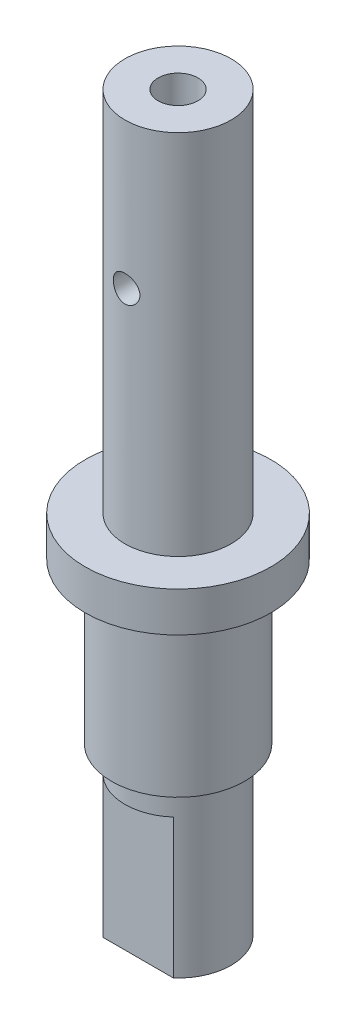
ISO-10303-21;
HEADER;
FILE_DESCRIPTION(('STEP AP214'),'2;1');
FILE_NAME('part.step','',(''),(''),'','','');
FILE_SCHEMA(('AUTOMOTIVE_DESIGN { 1 0 10303 214 1 1 1 1 }'));
ENDSEC;
DATA;
#1=APPLICATION_CONTEXT('core data for automotive mechanical design processes');
#2=APPLICATION_PROTOCOL_DEFINITION('international standard','automotive_design',2000,#1);
#3=PRODUCT_CONTEXT('',#1,'mechanical');
#4=PRODUCT('Part','Part','',(#3));
#5=PRODUCT_RELATED_PRODUCT_CATEGORY('part','',(#4));
#6=PRODUCT_DEFINITION_FORMATION('','',#4);
#7=PRODUCT_DEFINITION_CONTEXT('part definition',#1,'design');
#8=PRODUCT_DEFINITION('design','',#6,#7);
#9=PRODUCT_DEFINITION_SHAPE('','',#8);
#10=(LENGTH_UNIT() NAMED_UNIT(*) SI_UNIT(.MILLI.,.METRE.));
#11=(NAMED_UNIT(*) PLANE_ANGLE_UNIT() SI_UNIT($,.RADIAN.));
#12=(NAMED_UNIT(*) SI_UNIT($,.STERADIAN.) SOLID_ANGLE_UNIT());
#13=UNCERTAINTY_MEASURE_WITH_UNIT(LENGTH_MEASURE(1.E-05),#10,'distance_accuracy_value','');
#14=(GEOMETRIC_REPRESENTATION_CONTEXT(3) GLOBAL_UNCERTAINTY_ASSIGNED_CONTEXT((#13)) GLOBAL_UNIT_ASSIGNED_CONTEXT((#10,
#11,#12)) REPRESENTATION_CONTEXT('',''));
#15=CARTESIAN_POINT('',(0.,0.,0.));
#16=DIRECTION('',(0.,0.,1.));
#17=DIRECTION('',(1.,0.,0.));
#18=AXIS2_PLACEMENT_3D('',#15,#16,#17);
#19=CARTESIAN_POINT('',(0.,39.8,0.));
#20=DIRECTION('',(0.,-1.,0.));
#21=DIRECTION('',(0.,0.,-1.));
#22=AXIS2_PLACEMENT_3D('',#19,#20,#21);
#23=CYLINDRICAL_SURFACE('',#22,4.);
#24=CARTESIAN_POINT('',(0.,27.5,0.));
#25=DIRECTION('',(0.,1.,0.));
#26=DIRECTION('',(0.,0.,1.));
#27=AXIS2_PLACEMENT_3D('',#24,#25,#26);
#28=CIRCLE('',#27,4.);
#29=CARTESIAN_POINT('',(0.,27.5,4.));
#30=VERTEX_POINT('',#29);
#31=EDGE_CURVE('E74',#30,#30,#28,.T.);
#32=ORIENTED_EDGE('',*,*,#31,.T.);
#33=EDGE_LOOP('',(#32));
#34=FACE_BOUND('',#33,.T.);
#35=CARTESIAN_POINT('',(0.,55.15455,0.));
#36=DIRECTION('',(0.,1.,0.));
#37=DIRECTION('',(0.,0.,1.));
#38=AXIS2_PLACEMENT_3D('',#35,#36,#37);
#39=CIRCLE('',#38,4.);
#40=CARTESIAN_POINT('',(0.,55.15455,4.));
#41=VERTEX_POINT('',#40);
#42=EDGE_CURVE('E70',#41,#41,#39,.T.);
#43=ORIENTED_EDGE('',*,*,#42,.F.);
#44=EDGE_LOOP('',(#43));
#45=FACE_BOUND('',#44,.T.);
#46=CARTESIAN_POINT('',(-1.,44.15455,3.87298334620742));
#47=CARTESIAN_POINT('',(-0.999998431438699,44.0993296996432,3.87298440057185));
#48=CARTESIAN_POINT('',(-0.995410498208069,44.0440920405686,3.87417722499278));
#49=CARTESIAN_POINT('',(-0.977209250194446,43.9352029687674,3.87880744892249));
#50=CARTESIAN_POINT('',(-0.963590682698078,43.88155249822,3.8822461547418));
#51=CARTESIAN_POINT('',(-0.927796479849636,43.7774285847122,3.89095489813012));
#52=CARTESIAN_POINT('',(-0.905631891140945,43.7269511378422,3.8962225706936));
#53=CARTESIAN_POINT('',(-0.853408456505408,43.6304256589875,3.90799276818327));
#54=CARTESIAN_POINT('',(-0.823349275424506,43.5843778151688,3.91449534553241));
#55=CARTESIAN_POINT('',(-0.755483370924517,43.4970053418942,3.92816286540368));
#56=CARTESIAN_POINT('',(-0.717534755081556,43.4557925598597,3.93533839048709));
#57=CARTESIAN_POINT('',(-0.635272825640327,43.3802454422561,3.94945150206622));
#58=CARTESIAN_POINT('',(-0.590958917672139,43.3459117497514,3.95638906626691));
#59=CARTESIAN_POINT('',(-0.496458080431565,43.2846398129474,3.96936166208095));
#60=CARTESIAN_POINT('',(-0.446197830478044,43.2578114447354,3.975382749602));
#61=CARTESIAN_POINT('',(-0.341705273717111,43.2130261423388,3.9857232477043));
#62=CARTESIAN_POINT('',(-0.287473554316779,43.1950678992338,3.99004290933747));
#63=CARTESIAN_POINT('',(-0.177743503501666,43.1688908661686,3.99641903539262));
#64=CARTESIAN_POINT('',(-0.122293087819592,43.1604821422694,3.99851957537723));
#65=CARTESIAN_POINT('',(-0.0107315277051104,43.1530466482898,4.00037437642922));
#66=CARTESIAN_POINT('',(0.0453795178152254,43.1540184911162,4.00012898438682));
#67=CARTESIAN_POINT('',(0.155352247172385,43.1651799401001,3.99735237981413));
#68=CARTESIAN_POINT('',(0.209236215601064,43.1751645300215,3.99487200936349));
#69=CARTESIAN_POINT('',(0.314538247413684,43.2037385080194,3.98796334609942));
#70=CARTESIAN_POINT('',(0.365956179370436,43.222328354151,3.98353494959376));
#71=CARTESIAN_POINT('',(0.465406703501805,43.2677510282748,3.97315003880358));
#72=CARTESIAN_POINT('',(0.513404509766502,43.2946568178647,3.96718007878021));
#73=CARTESIAN_POINT('',(0.604275622340487,43.3558922716465,3.9543596152386));
#74=CARTESIAN_POINT('',(0.647148035085504,43.3902232274242,3.94750895860996));
#75=CARTESIAN_POINT('',(0.727774035084956,43.4664334967929,3.93345485507808));
#76=CARTESIAN_POINT('',(0.7653576790752,43.5084919569391,3.92624687810367));
#77=CARTESIAN_POINT('',(0.832976375963018,43.5983899894161,3.91246017406683));
#78=CARTESIAN_POINT('',(0.863011076046015,43.6462298317964,3.90588147642388));
#79=CARTESIAN_POINT('',(0.914788129022599,43.7466660136596,3.89408198732659));
#80=CARTESIAN_POINT('',(0.936489566970495,43.7992842921253,3.88886793490288));
#81=CARTESIAN_POINT('',(0.970685620636345,43.9075841872306,3.88047456055983));
#82=CARTESIAN_POINT('',(0.983182206552913,43.9632651455933,3.87729480324087));
#83=CARTESIAN_POINT('',(0.998331855466072,44.0745338006093,3.87342142415656));
#84=CARTESIAN_POINT('',(1.00123618956785,44.1300851173319,3.87266435637459));
#85=CARTESIAN_POINT('',(0.997806796206221,44.2408787746313,3.87354937392416));
#86=CARTESIAN_POINT('',(0.991473919139522,44.2961211431805,3.87519123840506));
#87=CARTESIAN_POINT('',(0.969970185575068,44.4037957059819,3.88062832781824));
#88=CARTESIAN_POINT('',(0.954945627312702,44.4562590906283,3.8843878809375));
#89=CARTESIAN_POINT('',(0.916647232668252,44.5579225831407,3.89360287308385));
#90=CARTESIAN_POINT('',(0.893372419085022,44.6071223036221,3.89905851299445));
#91=CARTESIAN_POINT('',(0.838708267174626,44.7019265111469,3.91118454837305));
#92=CARTESIAN_POINT('',(0.807168701534255,44.7474415360172,3.91787667442657));
#93=CARTESIAN_POINT('',(0.737060292934458,44.8326253451205,3.93166833228686));
#94=CARTESIAN_POINT('',(0.69849029480544,44.87229316666,3.93876793091388));
#95=CARTESIAN_POINT('',(0.614262720984726,44.9456744170284,3.95278961212642));
#96=CARTESIAN_POINT('',(0.568451952531594,44.9792140250195,3.95970280824734));
#97=CARTESIAN_POINT('',(0.47170268269468,45.0381243467805,3.97238886645493));
#98=CARTESIAN_POINT('',(0.420764448957598,45.0634954866433,3.97816178801584));
#99=CARTESIAN_POINT('',(0.315558201731099,45.1051284138112,3.98788046295326));
#100=CARTESIAN_POINT('',(0.261317381027889,45.1214557137516,3.99183932008964));
#101=CARTESIAN_POINT('',(0.150749760318814,45.1447341338434,3.99754117358315));
#102=CARTESIAN_POINT('',(0.0944233650412485,45.1516870634956,3.99928459757363));
#103=CARTESIAN_POINT('',(-0.0170835264433228,45.1559175895755,4.00034169408811));
#104=CARTESIAN_POINT('',(-0.0722538269660297,45.1534517090954,3.99971978880008));
#105=CARTESIAN_POINT('',(-0.181367496414736,45.1395021727057,3.99625896457423));
#106=CARTESIAN_POINT('',(-0.235310901780882,45.1280187849869,3.99342011157094));
#107=CARTESIAN_POINT('',(-0.340171035644812,45.0964977802291,3.98585432853963));
#108=CARTESIAN_POINT('',(-0.391102494581016,45.0765065466854,3.98113764502669));
#109=CARTESIAN_POINT('',(-0.488917053041465,45.0285794209807,3.97031288913382));
#110=CARTESIAN_POINT('',(-0.535799641265047,45.0006425273304,3.96420464137727));
#111=CARTESIAN_POINT('',(-0.625401928423895,44.9368347660029,3.95107249681342));
#112=CARTESIAN_POINT('',(-0.66799498830058,44.9007898570926,3.94403016945647));
#113=CARTESIAN_POINT('',(-0.746615020271247,44.8221271480262,3.92990649053207));
#114=CARTESIAN_POINT('',(-0.782640325068175,44.7795076839021,3.92282512952424));
#115=CARTESIAN_POINT('',(-0.847762026479239,44.6879485857987,3.90927475860683));
#116=CARTESIAN_POINT('',(-0.876716619446591,44.6389058765875,3.90281963730391));
#117=CARTESIAN_POINT('',(-0.92592689661562,44.5364945100772,3.8914395555011));
#118=CARTESIAN_POINT('',(-0.946188909759556,44.4831290338927,3.88651348244814));
#119=CARTESIAN_POINT('',(-0.974422528565571,44.3839729881737,3.87951908741315));
#120=CARTESIAN_POINT('',(-0.983993170595827,44.3386568356176,3.87708663005761));
#121=CARTESIAN_POINT('',(-0.996782292572818,44.2470811309985,3.87381838580358));
#122=CARTESIAN_POINT('',(-1.00000131437052,44.2008216597494,3.87298246270639));
#123=CARTESIAN_POINT('',(-1.,44.15455,3.87298334620742));
#124=B_SPLINE_CURVE_WITH_KNOTS('',3,(#46,#47,#48,#49,#50,#51,#52,#53,#54,#55,#56,#57,#58,#59,
#60,#61,#62,#63,#64,#65,#66,#67,#68,#69,#70,#71,#72,#73,#74,#75,#76,#77,#78,#79,#80,#81,#82,#83,
#84,#85,#86,#87,#88,#89,#90,#91,#92,#93,#94,#95,#96,#97,#98,#99,#100,#101,#102,#103,#104,#105,
#106,#107,#108,#109,#110,#111,#112,#113,#114,#115,#116,#117,#118,#119,#120,#121,#122,#123),
.UNSPECIFIED.,.T.,.F.,(4,2,2,2,2,2,2,2,2,2,2,2,2,2,2,2,2,2,2,2,2,2,2,2,2,2,2,2,2,2,2,2,2,2,2,2,
2,2,4),(0.,0.165490976675223,0.331078296534208,0.496452290829152,0.66183330698466,
0.830495816734648,0.999174085882211,1.17020598555442,1.34121263935111,1.50875500394413,
1.67627259462682,1.84007305071853,2.00388222686189,2.16917149698052,2.33448954183839,
2.50428186625039,2.67408212476195,2.84470572799636,3.01529280048094,3.18137429900961,
3.34744050869795,3.51078961999957,3.67415808564842,3.84073138339938,4.00733207550293,
4.17810132382402,4.34886166284095,4.51836829119046,4.6878421955989,4.85273378447257,
5.01762046947067,5.18161950620159,5.34563922291503,5.51358838629102,5.68158012622479,
5.85270590910146,6.02370688542922,6.16239130867207,6.30106390036083),.UNSPECIFIED.);
#125=CARTESIAN_POINT('',(-1.,44.15455,3.87298334620742));
#126=VERTEX_POINT('',#125);
#127=EDGE_CURVE('E83',#126,#126,#124,.T.);
#128=ORIENTED_EDGE('',*,*,#127,.F.);
#129=EDGE_LOOP('',(#128));
#130=FACE_BOUND('',#129,.T.);
#131=CARTESIAN_POINT('',(0.,45.15455,-4.));
#132=CARTESIAN_POINT('',(0.055250725779821,45.1545484495079,-3.99999906578675));
#133=CARTESIAN_POINT('',(0.110518771887176,45.1499556328175,-3.99884385421219));
#134=CARTESIAN_POINT('',(0.219470882513689,45.131733232462,-3.99434742553261));
#135=CARTESIAN_POINT('',(0.27315403124716,45.1180985269748,-3.99100496946646));
#136=CARTESIAN_POINT('',(0.377347248121718,45.0822571643586,-3.98250417554693));
#137=CARTESIAN_POINT('',(0.427861042286668,45.0600608008565,-3.97734801894725));
#138=CARTESIAN_POINT('',(0.524448087936285,45.0077624066368,-3.96576895871729));
#139=CARTESIAN_POINT('',(0.570521189565841,44.977660109254,-3.95934601236034));
#140=CARTESIAN_POINT('',(0.65786795153395,44.9097494735639,-3.94578275727867));
#141=CARTESIAN_POINT('',(0.699037126707384,44.8718089500272,-3.93863138099022));
#142=CARTESIAN_POINT('',(0.774499284802206,44.7895818633941,-3.92449080078353));
#143=CARTESIAN_POINT('',(0.808791491299427,44.7452945847023,-3.91750161525565));
#144=CARTESIAN_POINT('',(0.870017695199359,44.6508198488417,-3.9043651713314));
#145=CARTESIAN_POINT('',(0.896834810616908,44.6005545127931,-3.89823196313737));
#146=CARTESIAN_POINT('',(0.941597939033687,44.4960510588944,-3.88766329874815));
#147=CARTESIAN_POINT('',(0.959545370292891,44.4418135777828,-3.88322757115192));
#148=CARTESIAN_POINT('',(0.985703224536196,44.3320543345317,-3.87666984478367));
#149=CARTESIAN_POINT('',(0.994101512222228,44.2765800693001,-3.87450327383617));
#150=CARTESIAN_POINT('',(1.00150785004524,44.1649709539907,-3.87259575025161));
#151=CARTESIAN_POINT('',(1.00051742787865,44.1088362128676,-3.87285440299096));
#152=CARTESIAN_POINT('',(0.989324349759521,43.9989394615037,-3.87572803664412));
#153=CARTESIAN_POINT('',(0.979345560127014,43.9451529190233,-3.87828575334586));
#154=CARTESIAN_POINT('',(0.950816124602072,43.8400426327258,-3.88537806450989));
#155=CARTESIAN_POINT('',(0.932264868046284,43.7887190646473,-3.88991279980464));
#156=CARTESIAN_POINT('',(0.886926318624771,43.6893913224986,-3.90050075936124));
#157=CARTESIAN_POINT('',(0.860057778155275,43.6414258854736,-3.90656884979614));
#158=CARTESIAN_POINT('',(0.798904184009969,43.5506041934954,-3.91953140564257));
#159=CARTESIAN_POINT('',(0.764617832539226,43.5077488346218,-3.9264260155649));
#160=CARTESIAN_POINT('',(0.68844228312081,43.4270809228704,-3.94050587026521));
#161=CARTESIAN_POINT('',(0.64636417211057,43.3894470066258,-3.94769379651981));
#162=CARTESIAN_POINT('',(0.556407945002463,43.3217358383574,-3.96137310385857));
#163=CARTESIAN_POINT('',(0.508529651805292,43.2916588171576,-3.96786446366277));
#164=CARTESIAN_POINT('',(0.408077259120924,43.2398496091837,-3.97945154729455));
#165=CARTESIAN_POINT('',(0.355487595472413,43.2181464398304,-3.9845424008515));
#166=CARTESIAN_POINT('',(0.247250672095254,43.1839384628603,-3.99271944660946));
#167=CARTESIAN_POINT('',(0.191603999433655,43.1714318957212,-3.99580602226187));
#168=CARTESIAN_POINT('',(0.0803599802600168,43.1562449562941,-3.9995699951425));
#169=CARTESIAN_POINT('',(0.0247978133254723,43.1533213159498,-4.00030702338852));
#170=CARTESIAN_POINT('',(-0.086021916534339,43.1567160013703,-3.999458698763));
#171=CARTESIAN_POINT('',(-0.14127950642973,43.1630334951994,-3.99787355494564));
#172=CARTESIAN_POINT('',(-0.249076179184328,43.1845306055943,-3.99259720751571));
#173=CARTESIAN_POINT('',(-0.301643412645836,43.1995775089847,-3.98893756123874));
#174=CARTESIAN_POINT('',(-0.403504861635007,43.2379547226856,-3.97992471089423));
#175=CARTESIAN_POINT('',(-0.452798746021756,43.2612858695421,-3.97457133579928));
#176=CARTESIAN_POINT('',(-0.547682089619897,43.3160407525831,-3.96262205284207));
#177=CARTESIAN_POINT('',(-0.593190294557219,43.3476007415978,-3.95600578244621));
#178=CARTESIAN_POINT('',(-0.678351075762164,43.4177432725313,-3.94229672791613));
#179=CARTESIAN_POINT('',(-0.718002639315339,43.4563270264113,-3.93520386167803));
#180=CARTESIAN_POINT('',(-0.79132704538182,43.5405513072296,-3.92112637973847));
#181=CARTESIAN_POINT('',(-0.824829245081354,43.5863418020016,-3.91414869458187));
#182=CARTESIAN_POINT('',(-0.883673839341797,43.6830384229771,-3.90128585584826));
#183=CARTESIAN_POINT('',(-0.909016596105291,43.7339443219732,-3.89540065378017));
#184=CARTESIAN_POINT('',(-0.950634280406195,43.8391538149421,-3.88545396489777));
#185=CARTESIAN_POINT('',(-0.96696293110271,43.8934350855627,-3.88138170194604));
#186=CARTESIAN_POINT('',(-0.990230439969184,44.0040897585927,-3.87551162726789));
#187=CARTESIAN_POINT('',(-0.997171351652437,44.0604627006883,-3.87371331813291));
#188=CARTESIAN_POINT('',(-1.00135906022266,44.1719640159035,-3.87263267469305));
#189=CARTESIAN_POINT('',(-0.99887859852008,44.2270816234165,-3.87327955152176));
#190=CARTESIAN_POINT('',(-0.984918185541913,44.3360859257786,-3.87685272671895));
#191=CARTESIAN_POINT('',(-0.973438415124514,44.3899726453424,-3.87977897927904));
#192=CARTESIAN_POINT('',(-0.941954212961864,44.4946889727103,-3.88754173788482));
#193=CARTESIAN_POINT('',(-0.922000936453586,44.5455348701601,-3.89236676824206));
#194=CARTESIAN_POINT('',(-0.87417660907005,44.6431935884758,-3.90338503816552));
#195=CARTESIAN_POINT('',(-0.846304460022793,44.6900058487913,-3.90957846747182));
#196=CARTESIAN_POINT('',(-0.782578499091425,44.7795864193347,-3.92283756175675));
#197=CARTESIAN_POINT('',(-0.746535441941506,44.8222173822826,-3.92992176554505));
#198=CARTESIAN_POINT('',(-0.66785958079316,44.9009146965303,-3.94405351497524));
#199=CARTESIAN_POINT('',(-0.625225214174098,44.936979486742,-3.95110105151373));
#200=CARTESIAN_POINT('',(-0.533645057801725,45.0021575390431,-3.96451770431775));
#201=CARTESIAN_POINT('',(-0.484598948210923,45.0311330757811,-3.97087222243912));
#202=CARTESIAN_POINT('',(-0.382177373006983,45.0803816419604,-3.98203283316746));
#203=CARTESIAN_POINT('',(-0.328805042291159,45.100660907099,-3.98684003466521));
#204=CARTESIAN_POINT('',(-0.229606835495647,45.1289312202198,-3.99365373043694));
#205=CARTESIAN_POINT('',(-0.184253447272045,45.138517495369,-3.9960172336846));
#206=CARTESIAN_POINT('',(-0.0926040476908553,45.151327295748,-3.99919070154632));
#207=CARTESIAN_POINT('',(-0.0463081074950775,45.1545512995369,-4.00000078300596));
#208=CARTESIAN_POINT('',(0.,45.15455,-4.));
#209=B_SPLINE_CURVE_WITH_KNOTS('',3,(#131,#132,#133,#134,#135,#136,#137,#138,#139,#140,#141,
#142,#143,#144,#145,#146,#147,#148,#149,#150,#151,#152,#153,#154,#155,#156,#157,#158,#159,#160,
#161,#162,#163,#164,#165,#166,#167,#168,#169,#170,#171,#172,#173,#174,#175,#176,#177,#178,#179,
#180,#181,#182,#183,#184,#185,#186,#187,#188,#189,#190,#191,#192,#193,#194,#195,#196,#197,#198,
#199,#200,#201,#202,#203,#204,#205,#206,#207,#208),.UNSPECIFIED.,.T.,.F.,(4,2,2,2,2,2,2,2,2,2,2,
2,2,2,2,2,2,2,2,2,2,2,2,2,2,2,2,2,2,2,2,2,2,2,2,2,2,2,4),(0.,0.165582474981261,
0.331258825175934,0.496736601524069,0.662219960112887,0.830762902914267,0.999324863867081,
1.17039098363872,1.34142974112912,1.50904196732954,1.67662692075132,1.84014998004679,
2.00368468977359,2.16887018582587,2.33408460557443,2.50401000646014,2.67394059705499,
2.84445486006077,3.01493649125763,3.18105539299518,3.34715934075162,3.51080183009359,
3.67446084881527,3.84102391710235,4.0076157533868,4.17829672802985,4.34897012499672,
4.51861503076025,4.68822282168272,4.85295853599075,5.0176909397069,5.18144267039631,
5.34521712091268,5.51326384273273,5.68135046513612,5.85248123666393,6.02348909214234,
6.16228161961433,6.3010637069536),.UNSPECIFIED.);
#210=CARTESIAN_POINT('',(0.,45.15455,-4.));
#211=VERTEX_POINT('',#210);
#212=EDGE_CURVE('E36',#211,#211,#209,.T.);
#213=ORIENTED_EDGE('',*,*,#212,.F.);
#214=EDGE_LOOP('',(#213));
#215=FACE_BOUND('',#214,.T.);
#216=ADVANCED_FACE('F32',(#34,#45,#130,#215),#23,.T.);
#217=CARTESIAN_POINT('',(0.,12.5,0.));
#218=DIRECTION('',(0.,-1.,0.));
#219=DIRECTION('',(0.,0.,-1.));
#220=AXIS2_PLACEMENT_3D('',#217,#218,#219);
#221=CYLINDRICAL_SURFACE('',#220,4.);
#222=CARTESIAN_POINT('',(0.,12.5,0.));
#223=DIRECTION('',(0.,1.,0.));
#224=DIRECTION('',(0.,0.,1.));
#225=AXIS2_PLACEMENT_3D('',#222,#223,#224);
#226=CIRCLE('',#225,4.);
#227=CARTESIAN_POINT('',(0.,12.5,4.));
#228=VERTEX_POINT('',#227);
#229=EDGE_CURVE('E11',#228,#228,#226,.T.);
#230=ORIENTED_EDGE('',*,*,#229,.F.);
#231=EDGE_LOOP('',(#230));
#232=FACE_BOUND('',#231,.T.);
#233=CARTESIAN_POINT('',(0.,10.5,0.));
#234=DIRECTION('',(0.,-1.,0.));
#235=DIRECTION('',(0.,0.,-1.));
#236=AXIS2_PLACEMENT_3D('',#233,#234,#235);
#237=CIRCLE('',#236,4.);
#238=CARTESIAN_POINT('',(2.64575131106459,10.5,3.));
#239=VERTEX_POINT('',#238);
#240=CARTESIAN_POINT('',(-2.64575131106459,10.5,3.));
#241=VERTEX_POINT('',#240);
#242=EDGE_CURVE('E69',#239,#241,#237,.T.);
#243=ORIENTED_EDGE('',*,*,#242,.F.);
#244=DIRECTION('',(0.,-1.,0.));
#245=VECTOR('',#244,1.);
#246=CARTESIAN_POINT('',(2.64575131106459,10.5,3.));
#247=LINE('',#246,#245);
#248=CARTESIAN_POINT('',(2.64575131106459,0.,3.));
#249=VERTEX_POINT('',#248);
#250=EDGE_CURVE('E59',#239,#249,#247,.T.);
#251=ORIENTED_EDGE('',*,*,#250,.T.);
#252=CARTESIAN_POINT('',(0.,0.,0.));
#253=DIRECTION('',(0.,1.,0.));
#254=DIRECTION('',(0.,0.,1.));
#255=AXIS2_PLACEMENT_3D('',#252,#253,#254);
#256=CIRCLE('',#255,4.);
#257=CARTESIAN_POINT('',(-2.64575131106459,0.,3.));
#258=VERTEX_POINT('',#257);
#259=EDGE_CURVE('E45',#249,#258,#256,.T.);
#260=ORIENTED_EDGE('',*,*,#259,.T.);
#261=DIRECTION('',(0.,-1.,0.));
#262=VECTOR('',#261,1.);
#263=CARTESIAN_POINT('',(-2.64575131106459,10.5,3.));
#264=LINE('',#263,#262);
#265=EDGE_CURVE('E53',#241,#258,#264,.T.);
#266=ORIENTED_EDGE('',*,*,#265,.F.);
#267=EDGE_LOOP('',(#243,#251,#260,#266));
#268=FACE_BOUND('',#267,.T.);
#269=ADVANCED_FACE('F34',(#232,#268),#221,.T.);
#270=CARTESIAN_POINT('',(0.,0.,0.));
#271=DIRECTION('',(0.,1.,0.));
#272=DIRECTION('',(0.,0.,1.));
#273=AXIS2_PLACEMENT_3D('',#270,#271,#272);
#274=PLANE('',#273);
#275=ORIENTED_EDGE('',*,*,#259,.F.);
#276=DIRECTION('',(1.,0.,0.));
#277=VECTOR('',#276,1.);
#278=CARTESIAN_POINT('',(-2.64575131106459,0.,3.));
#279=LINE('',#278,#277);
#280=EDGE_CURVE('E64',#258,#249,#279,.T.);
#281=ORIENTED_EDGE('',*,*,#280,.F.);
#282=EDGE_LOOP('',(#275,#281));
#283=FACE_BOUND('',#282,.T.);
#284=ADVANCED_FACE('F76',(#283),#274,.F.);
#285=CARTESIAN_POINT('',(0.,24.5,0.));
#286=DIRECTION('',(0.,-1.,0.));
#287=DIRECTION('',(0.,0.,-1.));
#288=AXIS2_PLACEMENT_3D('',#285,#286,#287);
#289=CYLINDRICAL_SURFACE('',#288,5.);
#290=CARTESIAN_POINT('',(0.,24.5,0.));
#291=DIRECTION('',(0.,1.,0.));
#292=DIRECTION('',(0.,0.,1.));
#293=AXIS2_PLACEMENT_3D('',#290,#291,#292);
#294=CIRCLE('',#293,5.);
#295=CARTESIAN_POINT('',(0.,24.5,5.));
#296=VERTEX_POINT('',#295);
#297=EDGE_CURVE('E77',#296,#296,#294,.T.);
#298=ORIENTED_EDGE('',*,*,#297,.F.);
#299=EDGE_LOOP('',(#298));
#300=FACE_BOUND('',#299,.T.);
#301=CARTESIAN_POINT('',(0.,12.5,0.));
#302=DIRECTION('',(0.,1.,0.));
#303=DIRECTION('',(0.,0.,1.));
#304=AXIS2_PLACEMENT_3D('',#301,#302,#303);
#305=CIRCLE('',#304,5.);
#306=CARTESIAN_POINT('',(0.,12.5,5.));
#307=VERTEX_POINT('',#306);
#308=EDGE_CURVE('E80',#307,#307,#305,.T.);
#309=ORIENTED_EDGE('',*,*,#308,.T.);
#310=EDGE_LOOP('',(#309));
#311=FACE_BOUND('',#310,.T.);
#312=ADVANCED_FACE('F159',(#300,#311),#289,.T.);
#313=CARTESIAN_POINT('',(0.,12.5,0.));
#314=DIRECTION('',(0.,1.,0.));
#315=DIRECTION('',(0.,0.,1.));
#316=AXIS2_PLACEMENT_3D('',#313,#314,#315);
#317=PLANE('',#316);
#318=ORIENTED_EDGE('',*,*,#229,.T.);
#319=EDGE_LOOP('',(#318));
#320=FACE_BOUND('',#319,.T.);
#321=ORIENTED_EDGE('',*,*,#308,.F.);
#322=EDGE_LOOP('',(#321));
#323=FACE_BOUND('',#322,.T.);
#324=ADVANCED_FACE('F161',(#320,#323),#317,.F.);
#325=CARTESIAN_POINT('',(0.,27.5,0.));
#326=DIRECTION('',(0.,-1.,0.));
#327=DIRECTION('',(0.,0.,-1.));
#328=AXIS2_PLACEMENT_3D('',#325,#326,#327);
#329=CYLINDRICAL_SURFACE('',#328,7.);
#330=CARTESIAN_POINT('',(0.,27.5,0.));
#331=DIRECTION('',(0.,1.,0.));
#332=DIRECTION('',(0.,0.,1.));
#333=AXIS2_PLACEMENT_3D('',#330,#331,#332);
#334=CIRCLE('',#333,7.);
#335=CARTESIAN_POINT('',(0.,27.5,7.));
#336=VERTEX_POINT('',#335);
#337=EDGE_CURVE('E152',#336,#336,#334,.T.);
#338=ORIENTED_EDGE('',*,*,#337,.F.);
#339=EDGE_LOOP('',(#338));
#340=FACE_BOUND('',#339,.T.);
#341=CARTESIAN_POINT('',(0.,24.5,0.));
#342=DIRECTION('',(0.,1.,0.));
#343=DIRECTION('',(0.,0.,1.));
#344=AXIS2_PLACEMENT_3D('',#341,#342,#343);
#345=CIRCLE('',#344,7.);
#346=CARTESIAN_POINT('',(0.,24.5,7.));
#347=VERTEX_POINT('',#346);
#348=EDGE_CURVE('E151',#347,#347,#345,.T.);
#349=ORIENTED_EDGE('',*,*,#348,.T.);
#350=EDGE_LOOP('',(#349));
#351=FACE_BOUND('',#350,.T.);
#352=ADVANCED_FACE('F163',(#340,#351),#329,.T.);
#353=CARTESIAN_POINT('',(0.,27.5,0.));
#354=DIRECTION('',(0.,1.,0.));
#355=DIRECTION('',(0.,0.,1.));
#356=AXIS2_PLACEMENT_3D('',#353,#354,#355);
#357=PLANE('',#356);
#358=ORIENTED_EDGE('',*,*,#31,.F.);
#359=EDGE_LOOP('',(#358));
#360=FACE_BOUND('',#359,.T.);
#361=ORIENTED_EDGE('',*,*,#337,.T.);
#362=EDGE_LOOP('',(#361));
#363=FACE_BOUND('',#362,.T.);
#364=ADVANCED_FACE('F116',(#360,#363),#357,.T.);
#365=CARTESIAN_POINT('',(0.,24.5,0.));
#366=DIRECTION('',(0.,1.,0.));
#367=DIRECTION('',(0.,0.,1.));
#368=AXIS2_PLACEMENT_3D('',#365,#366,#367);
#369=PLANE('',#368);
#370=ORIENTED_EDGE('',*,*,#297,.T.);
#371=EDGE_LOOP('',(#370));
#372=FACE_BOUND('',#371,.T.);
#373=ORIENTED_EDGE('',*,*,#348,.F.);
#374=EDGE_LOOP('',(#373));
#375=FACE_BOUND('',#374,.T.);
#376=ADVANCED_FACE('F112',(#372,#375),#369,.F.);
#377=CARTESIAN_POINT('',(-2.64575131106459,10.5,3.));
#378=DIRECTION('',(0.,0.,-1.));
#379=DIRECTION('',(-1.,0.,0.));
#380=AXIS2_PLACEMENT_3D('',#377,#378,#379);
#381=PLANE('',#380);
#382=ORIENTED_EDGE('',*,*,#280,.T.);
#383=ORIENTED_EDGE('',*,*,#250,.F.);
#384=DIRECTION('',(1.,0.,0.));
#385=VECTOR('',#384,1.);
#386=CARTESIAN_POINT('',(-2.64575131106459,10.5,3.));
#387=LINE('',#386,#385);
#388=EDGE_CURVE('E147',#241,#239,#387,.T.);
#389=ORIENTED_EDGE('',*,*,#388,.F.);
#390=ORIENTED_EDGE('',*,*,#265,.T.);
#391=EDGE_LOOP('',(#382,#383,#389,#390));
#392=FACE_BOUND('',#391,.T.);
#393=ADVANCED_FACE('F65',(#392),#381,.F.);
#394=CARTESIAN_POINT('',(0.,10.5,0.));
#395=DIRECTION('',(0.,-1.,0.));
#396=DIRECTION('',(0.,0.,-1.));
#397=AXIS2_PLACEMENT_3D('',#394,#395,#396);
#398=PLANE('',#397);
#399=ORIENTED_EDGE('',*,*,#242,.T.);
#400=ORIENTED_EDGE('',*,*,#388,.T.);
#401=EDGE_LOOP('',(#399,#400));
#402=FACE_BOUND('',#401,.T.);
#403=ADVANCED_FACE('F107',(#402),#398,.T.);
#404=CARTESIAN_POINT('',(0.,55.15455,0.));
#405=DIRECTION('',(0.,1.,0.));
#406=DIRECTION('',(0.,0.,1.));
#407=AXIS2_PLACEMENT_3D('',#404,#405,#406);
#408=PLANE('',#407);
#409=CARTESIAN_POINT('',(0.,55.15455,0.));
#410=DIRECTION('',(0.,1.,0.));
#411=DIRECTION('',(0.,0.,1.));
#412=AXIS2_PLACEMENT_3D('',#409,#410,#411);
#413=CIRCLE('',#412,1.5);
#414=CARTESIAN_POINT('',(0.,55.15455,1.5));
#415=VERTEX_POINT('',#414);
#416=EDGE_CURVE('E136',#415,#415,#413,.T.);
#417=ORIENTED_EDGE('',*,*,#416,.F.);
#418=EDGE_LOOP('',(#417));
#419=FACE_BOUND('',#418,.T.);
#420=ORIENTED_EDGE('',*,*,#42,.T.);
#421=EDGE_LOOP('',(#420));
#422=FACE_BOUND('',#421,.T.);
#423=ADVANCED_FACE('F103',(#419,#422),#408,.T.);
#424=CARTESIAN_POINT('',(0.,47.15455,0.));
#425=DIRECTION('',(0.,1.,0.));
#426=DIRECTION('',(0.,0.,1.));
#427=AXIS2_PLACEMENT_3D('',#424,#425,#426);
#428=CYLINDRICAL_SURFACE('',#427,1.5);
#429=CARTESIAN_POINT('',(0.,47.15455,0.));
#430=DIRECTION('',(0.,1.,0.));
#431=DIRECTION('',(0.,0.,1.));
#432=AXIS2_PLACEMENT_3D('',#429,#430,#431);
#433=CIRCLE('',#432,1.5);
#434=CARTESIAN_POINT('',(0.,47.15455,1.5));
#435=VERTEX_POINT('',#434);
#436=EDGE_CURVE('E138',#435,#435,#433,.T.);
#437=ORIENTED_EDGE('',*,*,#436,.F.);
#438=EDGE_LOOP('',(#437));
#439=FACE_BOUND('',#438,.T.);
#440=ORIENTED_EDGE('',*,*,#416,.T.);
#441=EDGE_LOOP('',(#440));
#442=FACE_BOUND('',#441,.T.);
#443=ADVANCED_FACE('F99',(#439,#442),#428,.F.);
#444=CARTESIAN_POINT('',(0.,47.15455,0.));
#445=DIRECTION('',(0.,1.,0.));
#446=DIRECTION('',(0.,0.,1.));
#447=AXIS2_PLACEMENT_3D('',#444,#445,#446);
#448=PLANE('',#447);
#449=ORIENTED_EDGE('',*,*,#436,.T.);
#450=EDGE_LOOP('',(#449));
#451=FACE_BOUND('',#450,.T.);
#452=ADVANCED_FACE('F94',(#451),#448,.T.);
#453=CARTESIAN_POINT('',(0.,44.15455,23.));
#454=DIRECTION('',(0.,0.,-1.));
#455=DIRECTION('',(-1.,0.,0.));
#456=AXIS2_PLACEMENT_3D('',#453,#454,#455);
#457=CYLINDRICAL_SURFACE('',#456,1.);
#458=ORIENTED_EDGE('',*,*,#127,.T.);
#459=EDGE_LOOP('',(#458));
#460=FACE_BOUND('',#459,.T.);
#461=ORIENTED_EDGE('',*,*,#212,.T.);
#462=EDGE_LOOP('',(#461));
#463=FACE_BOUND('',#462,.T.);
#464=ADVANCED_FACE('F90',(#460,#463),#457,.F.);
#465=CLOSED_SHELL('',(#216,#269,#284,#312,#324,#352,#364,#376,#393,#403,#423,#443,#452,#464));
#466=MANIFOLD_SOLID_BREP('B2',#465);
#467=ADVANCED_BREP_SHAPE_REPRESENTATION('',(#18,#466),#14);
#468=SHAPE_DEFINITION_REPRESENTATION(#9,#467);
ENDSEC;
END-ISO-10303-21;
